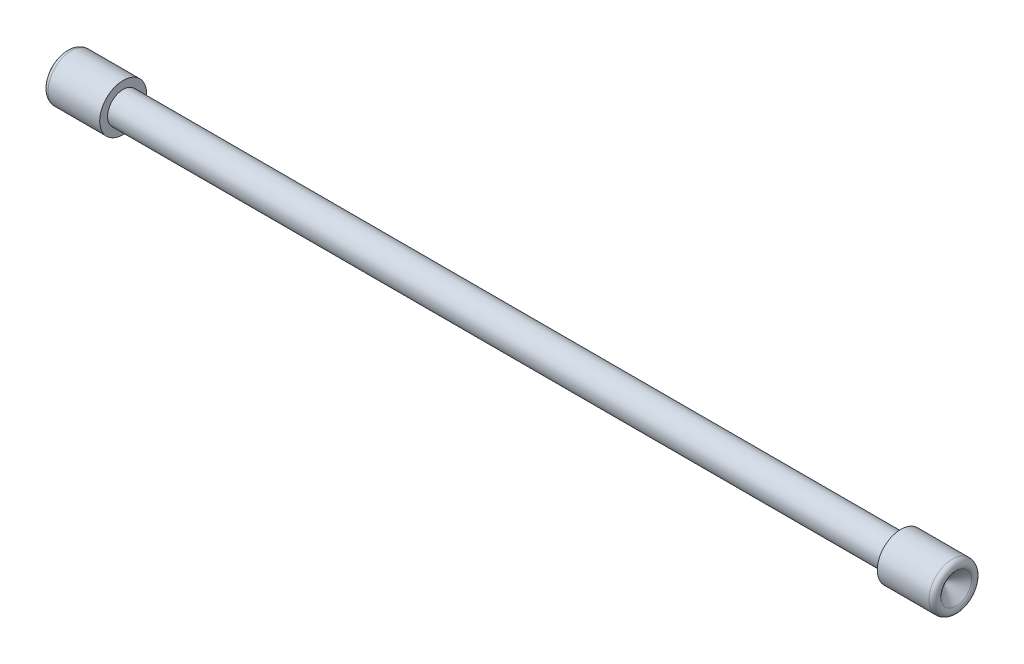
ISO-10303-21;
HEADER;
FILE_DESCRIPTION(('STEP AP214'),'2;1');
FILE_NAME('part.step','',(''),(''),'','','');
FILE_SCHEMA(('AUTOMOTIVE_DESIGN { 1 0 10303 214 1 1 1 1 }'));
ENDSEC;
DATA;
#1=APPLICATION_CONTEXT('core data for automotive mechanical design processes');
#2=APPLICATION_PROTOCOL_DEFINITION('international standard','automotive_design',2000,#1);
#3=PRODUCT_CONTEXT('',#1,'mechanical');
#4=PRODUCT('Part','Part','',(#3));
#5=PRODUCT_RELATED_PRODUCT_CATEGORY('part','',(#4));
#6=PRODUCT_DEFINITION_FORMATION('','',#4);
#7=PRODUCT_DEFINITION_CONTEXT('part definition',#1,'design');
#8=PRODUCT_DEFINITION('design','',#6,#7);
#9=PRODUCT_DEFINITION_SHAPE('','',#8);
#10=(LENGTH_UNIT() NAMED_UNIT(*) SI_UNIT(.MILLI.,.METRE.));
#11=(NAMED_UNIT(*) PLANE_ANGLE_UNIT() SI_UNIT($,.RADIAN.));
#12=(NAMED_UNIT(*) SI_UNIT($,.STERADIAN.) SOLID_ANGLE_UNIT());
#13=UNCERTAINTY_MEASURE_WITH_UNIT(LENGTH_MEASURE(1.E-05),#10,'distance_accuracy_value','');
#14=(GEOMETRIC_REPRESENTATION_CONTEXT(3) GLOBAL_UNCERTAINTY_ASSIGNED_CONTEXT((#13)) GLOBAL_UNIT_ASSIGNED_CONTEXT((#10,
#11,#12)) REPRESENTATION_CONTEXT('',''));
#15=CARTESIAN_POINT('',(0.,0.,0.));
#16=DIRECTION('',(0.,0.,1.));
#17=DIRECTION('',(1.,0.,0.));
#18=AXIS2_PLACEMENT_3D('',#15,#16,#17);
#19=CARTESIAN_POINT('',(141.64589803375,0.,0.));
#20=DIRECTION('',(1.,0.,0.));
#21=DIRECTION('',(0.,0.,-1.));
#22=AXIS2_PLACEMENT_3D('',#19,#20,#21);
#23=CONICAL_SURFACE('',#22,4.86803398874989,0.841068670567929);
#24=CARTESIAN_POINT('',(137.291796067501,0.,0.));
#25=VERTEX_POINT('',#24);
#26=VERTEX_LOOP('',#25);
#27=FACE_BOUND('',#26,.T.);
#28=CARTESIAN_POINT('',(141.64589803375,0.,0.));
#29=DIRECTION('',(-1.,0.,0.));
#30=DIRECTION('',(0.,0.,1.));
#31=AXIS2_PLACEMENT_3D('',#28,#29,#30);
#32=CIRCLE('',#31,4.86803398874989);
#33=CARTESIAN_POINT('',(141.64589803375,0.,4.86803398874989));
#34=VERTEX_POINT('',#33);
#35=EDGE_CURVE('E13',#34,#34,#32,.T.);
#36=ORIENTED_EDGE('',*,*,#35,.F.);
#37=EDGE_LOOP('',(#36));
#38=FACE_BOUND('',#37,.T.);
#39=ADVANCED_FACE('F49',(#27,#38),#23,.F.);
#40=CARTESIAN_POINT('',(140.468847050625,0.,0.));
#41=DIRECTION('',(-1.,0.,0.));
#42=DIRECTION('',(0.,0.,1.));
#43=AXIS2_PLACEMENT_3D('',#40,#41,#42);
#44=TOROIDAL_SURFACE('',#43,5.92082039324993,1.57917960675007);
#45=CARTESIAN_POINT('',(140.468847050625,0.,0.));
#46=DIRECTION('',(-1.,0.,0.));
#47=DIRECTION('',(0.,0.,1.));
#48=AXIS2_PLACEMENT_3D('',#45,#46,#47);
#49=CIRCLE('',#48,7.5);
#50=CARTESIAN_POINT('',(140.468847050625,0.,7.5));
#51=VERTEX_POINT('',#50);
#52=EDGE_CURVE('E56',#51,#51,#49,.T.);
#53=ORIENTED_EDGE('',*,*,#52,.F.);
#54=EDGE_LOOP('',(#53));
#55=FACE_BOUND('',#54,.T.);
#56=ORIENTED_EDGE('',*,*,#35,.T.);
#57=EDGE_LOOP('',(#56));
#58=FACE_BOUND('',#57,.T.);
#59=ADVANCED_FACE('F90',(#55,#58),#44,.T.);
#60=CARTESIAN_POINT('',(0.,0.,0.));
#61=DIRECTION('',(-1.,0.,0.));
#62=DIRECTION('',(0.,0.,1.));
#63=AXIS2_PLACEMENT_3D('',#60,#61,#62);
#64=CYLINDRICAL_SURFACE('',#63,7.5);
#65=ORIENTED_EDGE('',*,*,#52,.T.);
#66=EDGE_LOOP('',(#65));
#67=FACE_BOUND('',#66,.T.);
#68=CARTESIAN_POINT('',(124.,0.,0.));
#69=DIRECTION('',(-1.,0.,0.));
#70=DIRECTION('',(0.,0.,1.));
#71=AXIS2_PLACEMENT_3D('',#68,#69,#70);
#72=CIRCLE('',#71,7.5);
#73=CARTESIAN_POINT('',(124.,0.,7.5));
#74=VERTEX_POINT('',#73);
#75=EDGE_CURVE('E76',#74,#74,#72,.T.);
#76=ORIENTED_EDGE('',*,*,#75,.F.);
#77=EDGE_LOOP('',(#76));
#78=FACE_BOUND('',#77,.T.);
#79=ADVANCED_FACE('F87',(#67,#78),#64,.T.);
#80=CARTESIAN_POINT('',(124.,0.,0.));
#81=DIRECTION('',(-1.,0.,0.));
#82=DIRECTION('',(0.,0.,1.));
#83=AXIS2_PLACEMENT_3D('',#80,#81,#82);
#84=PLANE('',#83);
#85=ORIENTED_EDGE('',*,*,#75,.T.);
#86=EDGE_LOOP('',(#85));
#87=FACE_BOUND('',#86,.T.);
#88=CARTESIAN_POINT('',(124.,0.,0.));
#89=DIRECTION('',(-1.,0.,0.));
#90=DIRECTION('',(0.,0.,1.));
#91=AXIS2_PLACEMENT_3D('',#88,#89,#90);
#92=CIRCLE('',#91,5.);
#93=CARTESIAN_POINT('',(124.,0.,5.));
#94=VERTEX_POINT('',#93);
#95=EDGE_CURVE('E72',#94,#94,#92,.T.);
#96=ORIENTED_EDGE('',*,*,#95,.F.);
#97=EDGE_LOOP('',(#96));
#98=FACE_BOUND('',#97,.T.);
#99=ADVANCED_FACE('F108',(#87,#98),#84,.T.);
#100=CARTESIAN_POINT('',(0.,0.,0.));
#101=DIRECTION('',(-1.,0.,0.));
#102=DIRECTION('',(0.,0.,1.));
#103=AXIS2_PLACEMENT_3D('',#100,#101,#102);
#104=CYLINDRICAL_SURFACE('',#103,5.);
#105=ORIENTED_EDGE('',*,*,#95,.T.);
#106=EDGE_LOOP('',(#105));
#107=FACE_BOUND('',#106,.T.);
#108=CARTESIAN_POINT('',(-124.,0.,0.));
#109=DIRECTION('',(-1.,0.,0.));
#110=DIRECTION('',(0.,0.,1.));
#111=AXIS2_PLACEMENT_3D('',#108,#109,#110);
#112=CIRCLE('',#111,5.);
#113=CARTESIAN_POINT('',(-124.,0.,5.));
#114=VERTEX_POINT('',#113);
#115=EDGE_CURVE('E178',#114,#114,#112,.T.);
#116=ORIENTED_EDGE('',*,*,#115,.F.);
#117=EDGE_LOOP('',(#116));
#118=FACE_BOUND('',#117,.T.);
#119=ADVANCED_FACE('F66',(#107,#118),#104,.T.);
#120=CARTESIAN_POINT('',(-141.64589803375,0.,0.));
#121=DIRECTION('',(-1.,0.,0.));
#122=DIRECTION('',(0.,0.,-1.));
#123=AXIS2_PLACEMENT_3D('',#120,#121,#122);
#124=CONICAL_SURFACE('',#123,4.86803398874989,0.841068670567929);
#125=CARTESIAN_POINT('',(-137.291796067501,0.,0.));
#126=VERTEX_POINT('',#125);
#127=VERTEX_LOOP('',#126);
#128=FACE_BOUND('',#127,.T.);
#129=CARTESIAN_POINT('',(-141.64589803375,0.,0.));
#130=DIRECTION('',(-1.,0.,0.));
#131=DIRECTION('',(0.,0.,1.));
#132=AXIS2_PLACEMENT_3D('',#129,#130,#131);
#133=CIRCLE('',#132,4.86803398874989);
#134=CARTESIAN_POINT('',(-141.64589803375,0.,4.86803398874989));
#135=VERTEX_POINT('',#134);
#136=EDGE_CURVE('E70',#135,#135,#133,.T.);
#137=ORIENTED_EDGE('',*,*,#136,.T.);
#138=EDGE_LOOP('',(#137));
#139=FACE_BOUND('',#138,.T.);
#140=ADVANCED_FACE('F62',(#128,#139),#124,.F.);
#141=CARTESIAN_POINT('',(-140.468847050625,0.,0.));
#142=DIRECTION('',(1.,0.,0.));
#143=DIRECTION('',(0.,0.,1.));
#144=AXIS2_PLACEMENT_3D('',#141,#142,#143);
#145=TOROIDAL_SURFACE('',#144,5.92082039324993,1.57917960675007);
#146=CARTESIAN_POINT('',(-140.468847050625,0.,0.));
#147=DIRECTION('',(-1.,0.,0.));
#148=DIRECTION('',(0.,0.,1.));
#149=AXIS2_PLACEMENT_3D('',#146,#147,#148);
#150=CIRCLE('',#149,7.5);
#151=CARTESIAN_POINT('',(-140.468847050625,0.,7.5));
#152=VERTEX_POINT('',#151);
#153=EDGE_CURVE('E73',#152,#152,#150,.T.);
#154=ORIENTED_EDGE('',*,*,#153,.T.);
#155=EDGE_LOOP('',(#154));
#156=FACE_BOUND('',#155,.T.);
#157=ORIENTED_EDGE('',*,*,#136,.F.);
#158=EDGE_LOOP('',(#157));
#159=FACE_BOUND('',#158,.T.);
#160=ADVANCED_FACE('F65',(#156,#159),#145,.T.);
#161=CARTESIAN_POINT('',(0.,0.,0.));
#162=DIRECTION('',(1.,0.,0.));
#163=DIRECTION('',(0.,0.,1.));
#164=AXIS2_PLACEMENT_3D('',#161,#162,#163);
#165=CYLINDRICAL_SURFACE('',#164,7.5);
#166=ORIENTED_EDGE('',*,*,#153,.F.);
#167=EDGE_LOOP('',(#166));
#168=FACE_BOUND('',#167,.T.);
#169=CARTESIAN_POINT('',(-124.,0.,0.));
#170=DIRECTION('',(-1.,0.,0.));
#171=DIRECTION('',(0.,0.,1.));
#172=AXIS2_PLACEMENT_3D('',#169,#170,#171);
#173=CIRCLE('',#172,7.5);
#174=CARTESIAN_POINT('',(-124.,0.,7.5));
#175=VERTEX_POINT('',#174);
#176=EDGE_CURVE('E79',#175,#175,#173,.T.);
#177=ORIENTED_EDGE('',*,*,#176,.T.);
#178=EDGE_LOOP('',(#177));
#179=FACE_BOUND('',#178,.T.);
#180=ADVANCED_FACE('F133',(#168,#179),#165,.T.);
#181=CARTESIAN_POINT('',(-124.,0.,0.));
#182=DIRECTION('',(1.,0.,0.));
#183=DIRECTION('',(0.,0.,1.));
#184=AXIS2_PLACEMENT_3D('',#181,#182,#183);
#185=PLANE('',#184);
#186=ORIENTED_EDGE('',*,*,#176,.F.);
#187=EDGE_LOOP('',(#186));
#188=FACE_BOUND('',#187,.T.);
#189=ORIENTED_EDGE('',*,*,#115,.T.);
#190=EDGE_LOOP('',(#189));
#191=FACE_BOUND('',#190,.T.);
#192=ADVANCED_FACE('F141',(#188,#191),#185,.T.);
#193=CLOSED_SHELL('',(#39,#59,#79,#99,#119,#140,#160,#180,#192));
#194=MANIFOLD_SOLID_BREP('B2',#193);
#195=ADVANCED_BREP_SHAPE_REPRESENTATION('',(#18,#194),#14);
#196=SHAPE_DEFINITION_REPRESENTATION(#9,#195);
ENDSEC;
END-ISO-10303-21;
